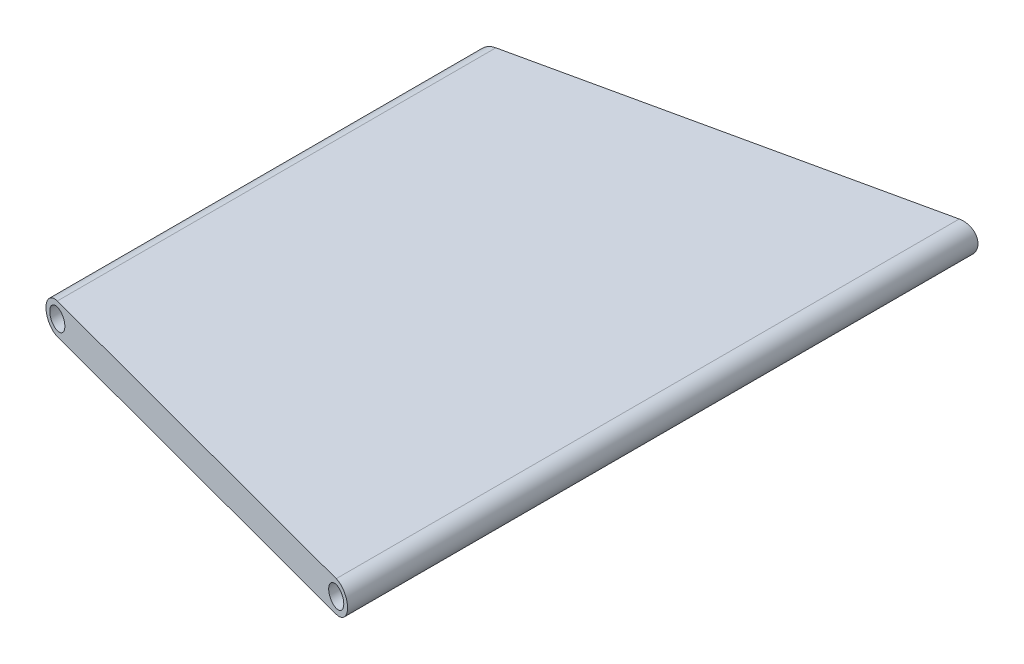
ISO-10303-21;
HEADER;
FILE_DESCRIPTION(('STEP AP214'),'2;1');
FILE_NAME('part.step','',(''),(''),'','','');
FILE_SCHEMA(('AUTOMOTIVE_DESIGN { 1 0 10303 214 1 1 1 1 }'));
ENDSEC;
DATA;
#1=APPLICATION_CONTEXT('core data for automotive mechanical design processes');
#2=APPLICATION_PROTOCOL_DEFINITION('international standard','automotive_design',2000,#1);
#3=PRODUCT_CONTEXT('',#1,'mechanical');
#4=PRODUCT('Part','Part','',(#3));
#5=PRODUCT_RELATED_PRODUCT_CATEGORY('part','',(#4));
#6=PRODUCT_DEFINITION_FORMATION('','',#4);
#7=PRODUCT_DEFINITION_CONTEXT('part definition',#1,'design');
#8=PRODUCT_DEFINITION('design','',#6,#7);
#9=PRODUCT_DEFINITION_SHAPE('','',#8);
#10=(LENGTH_UNIT() NAMED_UNIT(*) SI_UNIT(.MILLI.,.METRE.));
#11=(NAMED_UNIT(*) PLANE_ANGLE_UNIT() SI_UNIT($,.RADIAN.));
#12=(NAMED_UNIT(*) SI_UNIT($,.STERADIAN.) SOLID_ANGLE_UNIT());
#13=UNCERTAINTY_MEASURE_WITH_UNIT(LENGTH_MEASURE(1.E-05),#10,'distance_accuracy_value','');
#14=(GEOMETRIC_REPRESENTATION_CONTEXT(3) GLOBAL_UNCERTAINTY_ASSIGNED_CONTEXT((#13)) GLOBAL_UNIT_ASSIGNED_CONTEXT((#10,
#11,#12)) REPRESENTATION_CONTEXT('',''));
#15=CARTESIAN_POINT('',(0.,0.,0.));
#16=DIRECTION('',(0.,0.,1.));
#17=DIRECTION('',(1.,0.,0.));
#18=AXIS2_PLACEMENT_3D('',#15,#16,#17);
#19=CARTESIAN_POINT('',(-13.0564531905554,3.,49.1131502546459));
#20=DIRECTION('',(0.256920616307657,0.,-0.966432510274822));
#21=DIRECTION('',(-0.966432510274822,0.,-0.256920616307657));
#22=AXIS2_PLACEMENT_3D('',#19,#20,#21);
#23=PLANE('',#22);
#24=CARTESIAN_POINT('',(30.4251233387291,0.,60.6724814248645));
#25=DIRECTION('',(0.256920616307657,0.,-0.966432510274822));
#26=DIRECTION('',(0.966432510274822,0.,0.256920616307657));
#27=AXIS2_PLACEMENT_3D('',#24,#25,#26);
#28=ELLIPSE('',#27,2.06946680573821,2.);
#29=CARTESIAN_POINT('',(32.4251233387291,0.,61.204170112023));
#30=VERTEX_POINT('',#29);
#31=EDGE_CURVE('E109',#30,#30,#28,.T.);
#32=ORIENTED_EDGE('',*,*,#31,.T.);
#33=EDGE_LOOP('',(#32));
#34=FACE_BOUND('',#33,.T.);
#35=CARTESIAN_POINT('',(-43.5748766612709,0.,41.));
#36=DIRECTION('',(0.256920616307657,0.,-0.966432510274822));
#37=DIRECTION('',(0.966432510274822,0.,0.256920616307657));
#38=AXIS2_PLACEMENT_3D('',#35,#36,#37);
#39=ELLIPSE('',#38,2.06946680573822,2.);
#40=CARTESIAN_POINT('',(-41.5748766612709,0.,41.5316886871585));
#41=VERTEX_POINT('',#40);
#42=EDGE_CURVE('E143',#41,#41,#39,.T.);
#43=ORIENTED_EDGE('',*,*,#42,.T.);
#44=EDGE_LOOP('',(#43));
#45=FACE_BOUND('',#44,.T.);
#46=DIRECTION('',(0.966432510274822,0.,0.256920616307657));
#47=VECTOR('',#46,1.);
#48=CARTESIAN_POINT('',(-13.0564531905554,3.,49.1131502546459));
#49=LINE('',#48,#47);
#50=CARTESIAN_POINT('',(-43.5748766612709,3.,41.));
#51=VERTEX_POINT('',#50);
#52=CARTESIAN_POINT('',(30.4251233387291,3.,60.6724814248645));
#53=VERTEX_POINT('',#52);
#54=EDGE_CURVE('E117',#51,#53,#49,.T.);
#55=ORIENTED_EDGE('',*,*,#54,.F.);
#56=CARTESIAN_POINT('',(-43.5748766612709,0.,41.));
#57=DIRECTION('',(0.256920616307657,0.,-0.966432510274822));
#58=DIRECTION('',(-0.966432510274822,0.,-0.256920616307657));
#59=AXIS2_PLACEMENT_3D('',#56,#57,#58);
#60=ELLIPSE('',#59,3.10420020860732,3.);
#61=CARTESIAN_POINT('',(-43.5748766612709,-3.,41.));
#62=VERTEX_POINT('',#61);
#63=EDGE_CURVE('E128',#62,#51,#60,.T.);
#64=ORIENTED_EDGE('',*,*,#63,.F.);
#65=DIRECTION('',(0.966432510274822,0.,0.256920616307657));
#66=VECTOR('',#65,1.);
#67=CARTESIAN_POINT('',(-13.0564531905554,-3.,49.1131502546459));
#68=LINE('',#67,#66);
#69=CARTESIAN_POINT('',(30.4251233387291,-3.,60.6724814248645));
#70=VERTEX_POINT('',#69);
#71=EDGE_CURVE('E97',#62,#70,#68,.T.);
#72=ORIENTED_EDGE('',*,*,#71,.T.);
#73=CARTESIAN_POINT('',(30.4251233387291,0.,60.6724814248645));
#74=DIRECTION('',(0.256920616307657,0.,-0.966432510274822));
#75=DIRECTION('',(-0.966432510274822,0.,-0.256920616307657));
#76=AXIS2_PLACEMENT_3D('',#73,#74,#75);
#77=ELLIPSE('',#76,3.10420020860732,3.);
#78=EDGE_CURVE('E99',#53,#70,#77,.T.);
#79=ORIENTED_EDGE('',*,*,#78,.F.);
#80=EDGE_LOOP('',(#55,#64,#72,#79));
#81=FACE_BOUND('',#80,.T.);
#82=ADVANCED_FACE('F47',(#34,#45,#81),#23,.F.);
#83=CARTESIAN_POINT('',(-11.3116198477657,3.,-51.5064397656574));
#84=DIRECTION('',(-0.214503688159558,0.,-0.976723178677534));
#85=DIRECTION('',(-0.976723178677535,0.,0.214503688159558));
#86=AXIS2_PLACEMENT_3D('',#83,#84,#85);
#87=PLANE('',#86);
#88=CARTESIAN_POINT('',(30.4251233387291,0.,-60.6724814248645));
#89=DIRECTION('',(-0.214503688159558,0.,-0.976723178677534));
#90=DIRECTION('',(-0.976723178677535,0.,0.214503688159558));
#91=AXIS2_PLACEMENT_3D('',#88,#89,#90);
#92=ELLIPSE('',#91,2.04766308782388,2.);
#93=CARTESIAN_POINT('',(28.4251233387291,0.,-60.2332501404181));
#94=VERTEX_POINT('',#93);
#95=EDGE_CURVE('E131',#94,#94,#92,.F.);
#96=ORIENTED_EDGE('',*,*,#95,.T.);
#97=EDGE_LOOP('',(#96));
#98=FACE_BOUND('',#97,.T.);
#99=CARTESIAN_POINT('',(-43.5748766612709,0.,-44.4209239003472));
#100=DIRECTION('',(-0.214503688159558,0.,-0.976723178677534));
#101=DIRECTION('',(-0.976723178677535,0.,0.214503688159558));
#102=AXIS2_PLACEMENT_3D('',#99,#100,#101);
#103=ELLIPSE('',#102,2.04766308782389,2.);
#104=CARTESIAN_POINT('',(-45.5748766612709,0.,-43.9816926159008));
#105=VERTEX_POINT('',#104);
#106=EDGE_CURVE('E108',#105,#105,#103,.F.);
#107=ORIENTED_EDGE('',*,*,#106,.T.);
#108=EDGE_LOOP('',(#107));
#109=FACE_BOUND('',#108,.T.);
#110=DIRECTION('',(0.976723178677535,0.,-0.214503688159558));
#111=VECTOR('',#110,1.);
#112=CARTESIAN_POINT('',(-11.3116198477657,-3.,-51.5064397656574));
#113=LINE('',#112,#111);
#114=CARTESIAN_POINT('',(-43.5748766612709,-3.,-44.4209239003472));
#115=VERTEX_POINT('',#114);
#116=CARTESIAN_POINT('',(30.4251233387291,-3.,-60.6724814248645));
#117=VERTEX_POINT('',#116);
#118=EDGE_CURVE('E50',#115,#117,#113,.T.);
#119=ORIENTED_EDGE('',*,*,#118,.F.);
#120=CARTESIAN_POINT('',(-43.5748766612709,0.,-44.4209239003472));
#121=DIRECTION('',(-0.214503688159558,0.,-0.976723178677534));
#122=DIRECTION('',(-0.976723178677535,0.,0.214503688159558));
#123=AXIS2_PLACEMENT_3D('',#120,#121,#122);
#124=ELLIPSE('',#123,3.07149463173583,3.);
#125=CARTESIAN_POINT('',(-43.5748766612709,3.,-44.4209239003472));
#126=VERTEX_POINT('',#125);
#127=EDGE_CURVE('E102',#126,#115,#124,.F.);
#128=ORIENTED_EDGE('',*,*,#127,.F.);
#129=DIRECTION('',(0.976723178677535,0.,-0.214503688159558));
#130=VECTOR('',#129,1.);
#131=CARTESIAN_POINT('',(-11.3116198477657,3.,-51.5064397656574));
#132=LINE('',#131,#130);
#133=CARTESIAN_POINT('',(30.4251233387291,3.,-60.6724814248645));
#134=VERTEX_POINT('',#133);
#135=EDGE_CURVE('E11',#126,#134,#132,.T.);
#136=ORIENTED_EDGE('',*,*,#135,.T.);
#137=CARTESIAN_POINT('',(30.4251233387291,0.,-60.6724814248645));
#138=DIRECTION('',(-0.214503688159558,0.,-0.976723178677534));
#139=DIRECTION('',(-0.976723178677535,0.,0.214503688159558));
#140=AXIS2_PLACEMENT_3D('',#137,#138,#139);
#141=ELLIPSE('',#140,3.07149463173582,3.);
#142=EDGE_CURVE('E113',#117,#134,#141,.F.);
#143=ORIENTED_EDGE('',*,*,#142,.F.);
#144=EDGE_LOOP('',(#119,#128,#136,#143));
#145=FACE_BOUND('',#144,.T.);
#146=ADVANCED_FACE('F112',(#98,#109,#145),#87,.T.);
#147=CARTESIAN_POINT('',(0.,3.,0.));
#148=DIRECTION('',(0.,1.,0.));
#149=DIRECTION('',(0.,0.,1.));
#150=AXIS2_PLACEMENT_3D('',#147,#148,#149);
#151=PLANE('',#150);
#152=DIRECTION('',(0.,0.,-1.));
#153=VECTOR('',#152,1.);
#154=CARTESIAN_POINT('',(-43.5748766612709,3.,0.));
#155=LINE('',#154,#153);
#156=EDGE_CURVE('E105',#51,#126,#155,.T.);
#157=ORIENTED_EDGE('',*,*,#156,.F.);
#158=ORIENTED_EDGE('',*,*,#54,.T.);
#159=DIRECTION('',(0.,0.,1.));
#160=VECTOR('',#159,1.);
#161=CARTESIAN_POINT('',(30.4251233387291,3.,0.));
#162=LINE('',#161,#160);
#163=EDGE_CURVE('E57',#134,#53,#162,.T.);
#164=ORIENTED_EDGE('',*,*,#163,.F.);
#165=ORIENTED_EDGE('',*,*,#135,.F.);
#166=EDGE_LOOP('',(#157,#158,#164,#165));
#167=FACE_BOUND('',#166,.T.);
#168=ADVANCED_FACE('F167',(#167),#151,.T.);
#169=CARTESIAN_POINT('',(0.,-3.,0.));
#170=DIRECTION('',(0.,1.,0.));
#171=DIRECTION('',(0.,0.,1.));
#172=AXIS2_PLACEMENT_3D('',#169,#170,#171);
#173=PLANE('',#172);
#174=DIRECTION('',(0.,0.,-1.));
#175=VECTOR('',#174,1.);
#176=CARTESIAN_POINT('',(-43.5748766612709,-3.,0.));
#177=LINE('',#176,#175);
#178=EDGE_CURVE('E86',#62,#115,#177,.T.);
#179=ORIENTED_EDGE('',*,*,#178,.T.);
#180=ORIENTED_EDGE('',*,*,#118,.T.);
#181=DIRECTION('',(0.,0.,1.));
#182=VECTOR('',#181,1.);
#183=CARTESIAN_POINT('',(30.4251233387291,-3.,0.));
#184=LINE('',#183,#182);
#185=EDGE_CURVE('E74',#117,#70,#184,.T.);
#186=ORIENTED_EDGE('',*,*,#185,.T.);
#187=ORIENTED_EDGE('',*,*,#71,.F.);
#188=EDGE_LOOP('',(#179,#180,#186,#187));
#189=FACE_BOUND('',#188,.T.);
#190=ADVANCED_FACE('F94',(#189),#173,.F.);
#191=CARTESIAN_POINT('',(30.4251233387291,0.,69.3051241473176));
#192=DIRECTION('',(0.,0.,-1.));
#193=DIRECTION('',(-1.,0.,0.));
#194=AXIS2_PLACEMENT_3D('',#191,#192,#193);
#195=CYLINDRICAL_SURFACE('',#194,3.);
#196=ORIENTED_EDGE('',*,*,#78,.T.);
#197=ORIENTED_EDGE('',*,*,#185,.F.);
#198=ORIENTED_EDGE('',*,*,#142,.T.);
#199=ORIENTED_EDGE('',*,*,#163,.T.);
#200=EDGE_LOOP('',(#196,#197,#198,#199));
#201=FACE_BOUND('',#200,.T.);
#202=ADVANCED_FACE('F178',(#201),#195,.T.);
#203=CARTESIAN_POINT('',(-43.5748766612709,0.,69.3051241473176));
#204=DIRECTION('',(0.,0.,-1.));
#205=DIRECTION('',(-1.,0.,0.));
#206=AXIS2_PLACEMENT_3D('',#203,#204,#205);
#207=CYLINDRICAL_SURFACE('',#206,3.);
#208=ORIENTED_EDGE('',*,*,#156,.T.);
#209=ORIENTED_EDGE('',*,*,#127,.T.);
#210=ORIENTED_EDGE('',*,*,#178,.F.);
#211=ORIENTED_EDGE('',*,*,#63,.T.);
#212=EDGE_LOOP('',(#208,#209,#210,#211));
#213=FACE_BOUND('',#212,.T.);
#214=ADVANCED_FACE('F103',(#213),#207,.T.);
#215=CARTESIAN_POINT('',(30.4251233387291,0.,-69.2588714769407));
#216=DIRECTION('',(0.,0.,1.));
#217=DIRECTION('',(1.,0.,0.));
#218=AXIS2_PLACEMENT_3D('',#215,#216,#217);
#219=CYLINDRICAL_SURFACE('',#218,2.);
#220=ORIENTED_EDGE('',*,*,#95,.F.);
#221=EDGE_LOOP('',(#220));
#222=FACE_BOUND('',#221,.T.);
#223=ORIENTED_EDGE('',*,*,#31,.F.);
#224=EDGE_LOOP('',(#223));
#225=FACE_BOUND('',#224,.T.);
#226=ADVANCED_FACE('F152',(#222,#225),#219,.F.);
#227=CARTESIAN_POINT('',(-43.5748766612709,0.,-69.2588714769407));
#228=DIRECTION('',(0.,0.,1.));
#229=DIRECTION('',(1.,0.,0.));
#230=AXIS2_PLACEMENT_3D('',#227,#228,#229);
#231=CYLINDRICAL_SURFACE('',#230,2.);
#232=ORIENTED_EDGE('',*,*,#106,.F.);
#233=EDGE_LOOP('',(#232));
#234=FACE_BOUND('',#233,.T.);
#235=ORIENTED_EDGE('',*,*,#42,.F.);
#236=EDGE_LOOP('',(#235));
#237=FACE_BOUND('',#236,.T.);
#238=ADVANCED_FACE('F150',(#234,#237),#231,.F.);
#239=CLOSED_SHELL('',(#82,#146,#168,#190,#202,#214,#226,#238));
#240=MANIFOLD_SOLID_BREP('B2',#239);
#241=ADVANCED_BREP_SHAPE_REPRESENTATION('',(#18,#240),#14);
#242=SHAPE_DEFINITION_REPRESENTATION(#9,#241);
ENDSEC;
END-ISO-10303-21;
